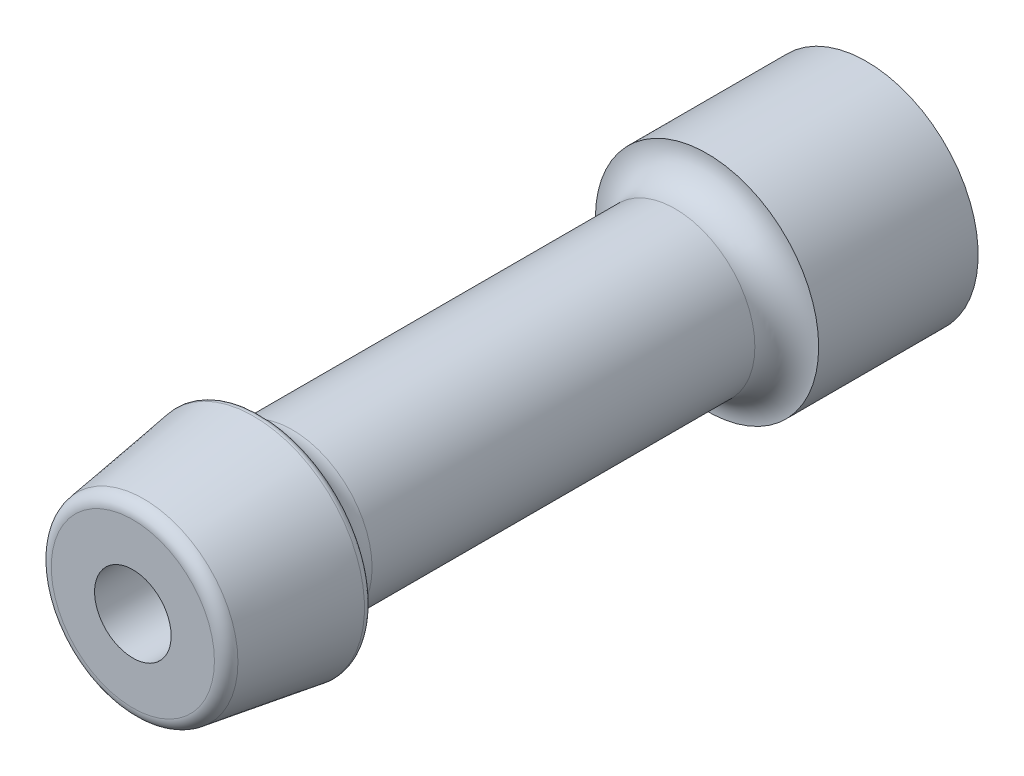
ISO-10303-21;
HEADER;
FILE_DESCRIPTION(('STEP AP214'),'2;1');
FILE_NAME('part.step','',(''),(''),'','','');
FILE_SCHEMA(('AUTOMOTIVE_DESIGN { 1 0 10303 214 1 1 1 1 }'));
ENDSEC;
DATA;
#1=APPLICATION_CONTEXT('core data for automotive mechanical design processes');
#2=APPLICATION_PROTOCOL_DEFINITION('international standard','automotive_design',2000,#1);
#3=PRODUCT_CONTEXT('',#1,'mechanical');
#4=PRODUCT('Part','Part','',(#3));
#5=PRODUCT_RELATED_PRODUCT_CATEGORY('part','',(#4));
#6=PRODUCT_DEFINITION_FORMATION('','',#4);
#7=PRODUCT_DEFINITION_CONTEXT('part definition',#1,'design');
#8=PRODUCT_DEFINITION('design','',#6,#7);
#9=PRODUCT_DEFINITION_SHAPE('','',#8);
#10=(LENGTH_UNIT() NAMED_UNIT(*) SI_UNIT(.MILLI.,.METRE.));
#11=(NAMED_UNIT(*) PLANE_ANGLE_UNIT() SI_UNIT($,.RADIAN.));
#12=(NAMED_UNIT(*) SI_UNIT($,.STERADIAN.) SOLID_ANGLE_UNIT());
#13=UNCERTAINTY_MEASURE_WITH_UNIT(LENGTH_MEASURE(1.E-05),#10,'distance_accuracy_value','');
#14=(GEOMETRIC_REPRESENTATION_CONTEXT(3) GLOBAL_UNCERTAINTY_ASSIGNED_CONTEXT((#13)) GLOBAL_UNIT_ASSIGNED_CONTEXT((#10,
#11,#12)) REPRESENTATION_CONTEXT('',''));
#15=CARTESIAN_POINT('',(0.,0.,0.));
#16=DIRECTION('',(0.,0.,1.));
#17=DIRECTION('',(1.,0.,0.));
#18=AXIS2_PLACEMENT_3D('',#15,#16,#17);
#19=CARTESIAN_POINT('',(0.,0.,29.21));
#20=DIRECTION('',(0.,0.,-1.));
#21=DIRECTION('',(-1.,0.,0.));
#22=AXIS2_PLACEMENT_3D('',#19,#20,#21);
#23=CYLINDRICAL_SURFACE('',#22,4.445);
#24=CARTESIAN_POINT('',(0.,0.,0.));
#25=DIRECTION('',(0.,0.,1.));
#26=DIRECTION('',(1.,0.,0.));
#27=AXIS2_PLACEMENT_3D('',#24,#25,#26);
#28=CIRCLE('',#27,4.445);
#29=CARTESIAN_POINT('',(-4.445,0.,0.));
#30=VERTEX_POINT('',#29);
#31=EDGE_CURVE('E71',#30,#30,#28,.T.);
#32=CARTESIAN_POINT('',(0.,0.,6.35));
#33=DIRECTION('',(0.,0.,1.));
#34=DIRECTION('',(1.,0.,0.));
#35=AXIS2_PLACEMENT_3D('',#32,#33,#34);
#36=CIRCLE('',#35,4.445);
#37=CARTESIAN_POINT('',(-4.445,0.,6.34999999999999));
#38=VERTEX_POINT('',#37);
#39=EDGE_CURVE('E72',#38,#38,#36,.T.);
#40=CARTESIAN_POINT('',(-4.445,0.,0.));
#41=CARTESIAN_POINT('',(-4.445,0.,0.066145833333333));
#42=CARTESIAN_POINT('',(-4.445,0.,0.132291666666666));
#43=CARTESIAN_POINT('',(-4.445,0.,0.264583333333332));
#44=CARTESIAN_POINT('',(-4.445,0.,0.330729166666665));
#45=CARTESIAN_POINT('',(-4.445,0.,0.463020833333332));
#46=CARTESIAN_POINT('',(-4.445,0.,0.529166666666666));
#47=CARTESIAN_POINT('',(-4.445,0.,0.661458333333333));
#48=CARTESIAN_POINT('',(-4.445,0.,0.727604166666666));
#49=CARTESIAN_POINT('',(-4.445,0.,0.859895833333332));
#50=CARTESIAN_POINT('',(-4.445,0.,0.926041666666665));
#51=CARTESIAN_POINT('',(-4.445,0.,1.05833333333333));
#52=CARTESIAN_POINT('',(-4.445,0.,1.12447916666667));
#53=CARTESIAN_POINT('',(-4.445,0.,1.25677083333333));
#54=CARTESIAN_POINT('',(-4.445,0.,1.32291666666667));
#55=CARTESIAN_POINT('',(-4.445,0.,1.45520833333333));
#56=CARTESIAN_POINT('',(-4.445,0.,1.52135416666667));
#57=CARTESIAN_POINT('',(-4.445,0.,1.65364583333333));
#58=CARTESIAN_POINT('',(-4.445,0.,1.71979166666666));
#59=CARTESIAN_POINT('',(-4.445,0.,1.85208333333333));
#60=CARTESIAN_POINT('',(-4.445,0.,1.91822916666666));
#61=CARTESIAN_POINT('',(-4.445,0.,2.05052083333333));
#62=CARTESIAN_POINT('',(-4.445,0.,2.11666666666666));
#63=CARTESIAN_POINT('',(-4.445,0.,2.24895833333333));
#64=CARTESIAN_POINT('',(-4.445,0.,2.31510416666667));
#65=CARTESIAN_POINT('',(-4.445,0.,2.44739583333333));
#66=CARTESIAN_POINT('',(-4.445,0.,2.51354166666666));
#67=CARTESIAN_POINT('',(-4.445,0.,2.64583333333333));
#68=CARTESIAN_POINT('',(-4.445,0.,2.71197916666667));
#69=CARTESIAN_POINT('',(-4.445,0.,2.84427083333333));
#70=CARTESIAN_POINT('',(-4.445,0.,2.91041666666667));
#71=CARTESIAN_POINT('',(-4.445,0.,3.04270833333333));
#72=CARTESIAN_POINT('',(-4.445,0.,3.10885416666666));
#73=CARTESIAN_POINT('',(-4.445,0.,3.24114583333333));
#74=CARTESIAN_POINT('',(-4.445,0.,3.30729166666666));
#75=CARTESIAN_POINT('',(-4.445,0.,3.43958333333333));
#76=CARTESIAN_POINT('',(-4.445,0.,3.50572916666666));
#77=CARTESIAN_POINT('',(-4.445,0.,3.63802083333333));
#78=CARTESIAN_POINT('',(-4.445,0.,3.70416666666666));
#79=CARTESIAN_POINT('',(-4.445,0.,3.83645833333333));
#80=CARTESIAN_POINT('',(-4.445,0.,3.90260416666666));
#81=CARTESIAN_POINT('',(-4.445,0.,4.03489583333333));
#82=CARTESIAN_POINT('',(-4.445,0.,4.10104166666666));
#83=CARTESIAN_POINT('',(-4.445,0.,4.23333333333333));
#84=CARTESIAN_POINT('',(-4.445,0.,4.29947916666666));
#85=CARTESIAN_POINT('',(-4.445,0.,4.43177083333333));
#86=CARTESIAN_POINT('',(-4.445,0.,4.49791666666666));
#87=CARTESIAN_POINT('',(-4.445,0.,4.63020833333333));
#88=CARTESIAN_POINT('',(-4.445,0.,4.69635416666666));
#89=CARTESIAN_POINT('',(-4.445,0.,4.82864583333333));
#90=CARTESIAN_POINT('',(-4.445,0.,4.89479166666666));
#91=CARTESIAN_POINT('',(-4.445,0.,5.02708333333333));
#92=CARTESIAN_POINT('',(-4.445,0.,5.09322916666666));
#93=CARTESIAN_POINT('',(-4.445,0.,5.22552083333333));
#94=CARTESIAN_POINT('',(-4.445,0.,5.29166666666666));
#95=CARTESIAN_POINT('',(-4.445,0.,5.42395833333333));
#96=CARTESIAN_POINT('',(-4.445,0.,5.49010416666666));
#97=CARTESIAN_POINT('',(-4.445,0.,5.62239583333333));
#98=CARTESIAN_POINT('',(-4.445,0.,5.68854166666666));
#99=CARTESIAN_POINT('',(-4.445,0.,5.82083333333333));
#100=CARTESIAN_POINT('',(-4.445,0.,5.88697916666666));
#101=CARTESIAN_POINT('',(-4.445,0.,6.01927083333333));
#102=CARTESIAN_POINT('',(-4.445,0.,6.08541666666666));
#103=CARTESIAN_POINT('',(-4.445,0.,6.21770833333333));
#104=CARTESIAN_POINT('',(-4.445,0.,6.28385416666666));
#105=CARTESIAN_POINT('',(-4.445,0.,6.34999999999999));
#106=B_SPLINE_CURVE_WITH_KNOTS('',3,(#40,#41,#42,#43,#44,#45,#46,#47,#48,#49,#50,#51,#52,#53,
#54,#55,#56,#57,#58,#59,#60,#61,#62,#63,#64,#65,#66,#67,#68,#69,#70,#71,#72,#73,#74,#75,#76,#77,
#78,#79,#80,#81,#82,#83,#84,#85,#86,#87,#88,#89,#90,#91,#92,#93,#94,#95,#96,#97,#98,#99,#100,
#101,#102,#103,#104,#105),.UNSPECIFIED.,.F.,.F.,(4,2,2,2,2,2,2,2,2,2,2,2,2,2,2,2,2,2,2,2,2,2,2,
2,2,2,2,2,2,2,2,2,4),(0.,0.198437499999999,0.396874999999998,0.5953125,0.793749999999999,
0.992187499999998,1.190625,1.3890625,1.5875,1.7859375,1.984375,2.1828125,2.38125,2.5796875,
2.778125,2.9765625,3.175,3.3734375,3.571875,3.7703125,3.96875,4.1671875,4.365625,4.5640625,
4.7625,4.96093749999999,5.15937499999999,5.3578125,5.55625,5.75468749999999,5.953125,6.1515625,
6.34999999999999),.UNSPECIFIED.);
#107=EDGE_CURVE('BSEAM39',#30,#38,#106,.T.);
#108=ORIENTED_EDGE('',*,*,#31,.T.);
#109=ORIENTED_EDGE('',*,*,#39,.F.);
#110=ORIENTED_EDGE('',*,*,#107,.T.);
#111=ORIENTED_EDGE('',*,*,#107,.F.);
#112=EDGE_LOOP('',(#108,#110,#109,#111));
#113=FACE_BOUND('',#112,.T.);
#114=ADVANCED_FACE('F39',(#113),#23,.T.);
#115=CARTESIAN_POINT('',(0.,0.,29.21));
#116=DIRECTION('',(0.,0.,1.));
#117=DIRECTION('',(1.,0.,0.));
#118=AXIS2_PLACEMENT_3D('',#115,#116,#117);
#119=PLANE('',#118);
#120=CARTESIAN_POINT('',(0.,0.,29.21));
#121=DIRECTION('',(0.,0.,1.));
#122=DIRECTION('',(1.,0.,0.));
#123=AXIS2_PLACEMENT_3D('',#120,#121,#122);
#124=CIRCLE('',#123,3.24806810887687);
#125=CARTESIAN_POINT('',(3.24806810887687,0.,29.21));
#126=VERTEX_POINT('',#125);
#127=EDGE_CURVE('E47',#126,#126,#124,.T.);
#128=ORIENTED_EDGE('',*,*,#127,.T.);
#129=EDGE_LOOP('',(#128));
#130=FACE_BOUND('',#129,.T.);
#131=CARTESIAN_POINT('',(0.,0.,29.21));
#132=DIRECTION('',(0.,0.,1.));
#133=DIRECTION('',(1.,0.,0.));
#134=AXIS2_PLACEMENT_3D('',#131,#132,#133);
#135=CIRCLE('',#134,1.524);
#136=CARTESIAN_POINT('',(1.524,0.,29.21));
#137=VERTEX_POINT('',#136);
#138=EDGE_CURVE('E76',#137,#137,#135,.T.);
#139=ORIENTED_EDGE('',*,*,#138,.F.);
#140=EDGE_LOOP('',(#139));
#141=FACE_BOUND('',#140,.T.);
#142=ADVANCED_FACE('F90',(#130,#141),#119,.T.);
#143=CARTESIAN_POINT('',(0.,0.,0.));
#144=DIRECTION('',(0.,0.,1.));
#145=DIRECTION('',(1.,0.,0.));
#146=AXIS2_PLACEMENT_3D('',#143,#144,#145);
#147=PLANE('',#146);
#148=CARTESIAN_POINT('',(0.,0.,0.));
#149=DIRECTION('',(0.,0.,1.));
#150=DIRECTION('',(1.,0.,0.));
#151=AXIS2_PLACEMENT_3D('',#148,#149,#150);
#152=CIRCLE('',#151,1.524);
#153=CARTESIAN_POINT('',(1.524,0.,0.));
#154=VERTEX_POINT('',#153);
#155=EDGE_CURVE('E80',#154,#154,#152,.T.);
#156=ORIENTED_EDGE('',*,*,#155,.T.);
#157=EDGE_LOOP('',(#156));
#158=FACE_BOUND('',#157,.T.);
#159=ORIENTED_EDGE('',*,*,#31,.F.);
#160=EDGE_LOOP('',(#159));
#161=FACE_BOUND('',#160,.T.);
#162=ADVANCED_FACE('F92',(#158,#161),#147,.F.);
#163=CARTESIAN_POINT('',(0.,0.,30.21));
#164=DIRECTION('',(0.,0.,-1.));
#165=DIRECTION('',(-1.,0.,0.));
#166=AXIS2_PLACEMENT_3D('',#163,#164,#165);
#167=CYLINDRICAL_SURFACE('',#166,1.524);
#168=ORIENTED_EDGE('',*,*,#155,.F.);
#169=EDGE_LOOP('',(#168));
#170=FACE_BOUND('',#169,.T.);
#171=ORIENTED_EDGE('',*,*,#138,.T.);
#172=EDGE_LOOP('',(#171));
#173=FACE_BOUND('',#172,.T.);
#174=ADVANCED_FACE('F88',(#170,#173),#167,.F.);
#175=CARTESIAN_POINT('',(0.,0.,6.35));
#176=DIRECTION('',(0.,0.,1.));
#177=DIRECTION('',(1.,0.,0.));
#178=AXIS2_PLACEMENT_3D('',#175,#176,#177);
#179=CYLINDRICAL_SURFACE('',#178,3.175);
#180=CARTESIAN_POINT('',(0.,0.,22.86));
#181=DIRECTION('',(0.,0.,1.));
#182=DIRECTION('',(1.,0.,0.));
#183=AXIS2_PLACEMENT_3D('',#180,#181,#182);
#184=CIRCLE('',#183,3.175);
#185=CARTESIAN_POINT('',(3.175,0.,22.86));
#186=VERTEX_POINT('',#185);
#187=EDGE_CURVE('E63',#186,#186,#184,.F.);
#188=ORIENTED_EDGE('',*,*,#187,.T.);
#189=EDGE_LOOP('',(#188));
#190=FACE_BOUND('',#189,.T.);
#191=CARTESIAN_POINT('',(0.,0.,7.62));
#192=DIRECTION('',(0.,0.,1.));
#193=DIRECTION('',(1.,0.,0.));
#194=AXIS2_PLACEMENT_3D('',#191,#192,#193);
#195=CIRCLE('',#194,3.175);
#196=CARTESIAN_POINT('',(3.175,0.,7.62));
#197=VERTEX_POINT('',#196);
#198=EDGE_CURVE('E67',#197,#197,#195,.T.);
#199=ORIENTED_EDGE('',*,*,#198,.T.);
#200=EDGE_LOOP('',(#199));
#201=FACE_BOUND('',#200,.T.);
#202=ADVANCED_FACE('F109',(#190,#201),#179,.T.);
#203=CARTESIAN_POINT('',(0.,0.,7.62));
#204=DIRECTION('',(0.,0.,1.));
#205=DIRECTION('',(1.,0.,0.));
#206=AXIS2_PLACEMENT_3D('',#203,#204,#205);
#207=TOROIDAL_SURFACE('',#206,4.445,1.27);
#208=ORIENTED_EDGE('',*,*,#39,.T.);
#209=EDGE_LOOP('',(#208));
#210=FACE_BOUND('',#209,.T.);
#211=ORIENTED_EDGE('',*,*,#198,.F.);
#212=EDGE_LOOP('',(#211));
#213=FACE_BOUND('',#212,.T.);
#214=ADVANCED_FACE('F105',(#210,#213),#207,.F.);
#215=CARTESIAN_POINT('',(0.,0.,22.86));
#216=DIRECTION('',(0.,0.,1.));
#217=DIRECTION('',(1.,0.,0.));
#218=AXIS2_PLACEMENT_3D('',#215,#216,#217);
#219=TOROIDAL_SURFACE('',#218,4.445,1.27);
#220=CARTESIAN_POINT('',(0.,0.,24.1066973734676));
#221=DIRECTION('',(0.,0.,-1.));
#222=DIRECTION('',(-1.,0.,0.));
#223=AXIS2_PLACEMENT_3D('',#220,#221,#222);
#224=CIRCLE('',#223,4.20283134185255);
#225=CARTESIAN_POINT('',(-4.20283134185255,0.,24.1066973734676));
#226=VERTEX_POINT('',#225);
#227=EDGE_CURVE('E52',#226,#226,#224,.T.);
#228=ORIENTED_EDGE('',*,*,#227,.T.);
#229=EDGE_LOOP('',(#228));
#230=FACE_BOUND('',#229,.T.);
#231=ORIENTED_EDGE('',*,*,#187,.F.);
#232=EDGE_LOOP('',(#231));
#233=FACE_BOUND('',#232,.T.);
#234=ADVANCED_FACE('F108',(#230,#233),#219,.F.);
#235=CARTESIAN_POINT('',(0.,0.,29.21));
#236=DIRECTION('',(0.,0.,-1.));
#237=DIRECTION('',(-1.,0.,0.));
#238=AXIS2_PLACEMENT_3D('',#235,#236,#237);
#239=CONICAL_SURFACE('',#238,3.68578891314646,0.148352986419515);
#240=CARTESIAN_POINT('',(0.,0.,28.7770871808538));
#241=DIRECTION('',(0.,0.,1.));
#242=DIRECTION('',(1.,0.,0.));
#243=AXIS2_PLACEMENT_3D('',#240,#241,#242);
#244=CIRCLE('',#243,3.75048816746473);
#245=CARTESIAN_POINT('',(3.75048816746473,0.,28.7770871808538));
#246=VERTEX_POINT('',#245);
#247=EDGE_CURVE('E10',#246,#246,#244,.F.);
#248=ORIENTED_EDGE('',*,*,#247,.T.);
#249=EDGE_LOOP('',(#248));
#250=FACE_BOUND('',#249,.T.);
#251=CARTESIAN_POINT('',(0.,0.,24.3935804385881));
#252=DIRECTION('',(0.,0.,-1.));
#253=DIRECTION('',(-1.,0.,0.));
#254=AXIS2_PLACEMENT_3D('',#251,#252,#253);
#255=CIRCLE('',#254,4.40560763951698);
#256=CARTESIAN_POINT('',(-4.40560763951698,0.,24.3935804385881));
#257=VERTEX_POINT('',#256);
#258=EDGE_CURVE('E57',#257,#257,#255,.F.);
#259=ORIENTED_EDGE('',*,*,#258,.T.);
#260=EDGE_LOOP('',(#259));
#261=FACE_BOUND('',#260,.T.);
#262=ADVANCED_FACE('F113',(#250,#261),#239,.T.);
#263=CARTESIAN_POINT('',(0.,0.,24.3560368481611));
#264=DIRECTION('',(0.,0.,-1.));
#265=DIRECTION('',(-1.,0.,0.));
#266=AXIS2_PLACEMENT_3D('',#263,#264,#265);
#267=TOROIDAL_SURFACE('',#266,4.15439761022306,0.254);
#268=ORIENTED_EDGE('',*,*,#227,.F.);
#269=EDGE_LOOP('',(#268));
#270=FACE_BOUND('',#269,.T.);
#271=ORIENTED_EDGE('',*,*,#258,.F.);
#272=EDGE_LOOP('',(#271));
#273=FACE_BOUND('',#272,.T.);
#274=ADVANCED_FACE('F119',(#270,#273),#267,.T.);
#275=CARTESIAN_POINT('',(0.,0.,28.702));
#276=DIRECTION('',(0.,0.,1.));
#277=DIRECTION('',(1.,0.,0.));
#278=AXIS2_PLACEMENT_3D('',#275,#276,#277);
#279=TOROIDAL_SURFACE('',#278,3.24806810887687,0.508);
#280=ORIENTED_EDGE('',*,*,#247,.F.);
#281=EDGE_LOOP('',(#280));
#282=FACE_BOUND('',#281,.T.);
#283=ORIENTED_EDGE('',*,*,#127,.F.);
#284=EDGE_LOOP('',(#283));
#285=FACE_BOUND('',#284,.T.);
#286=ADVANCED_FACE('F41',(#282,#285),#279,.T.);
#287=CLOSED_SHELL('',(#114,#142,#162,#174,#202,#214,#234,#262,#274,#286));
#288=MANIFOLD_SOLID_BREP('B2',#287);
#289=ADVANCED_BREP_SHAPE_REPRESENTATION('',(#18,#288),#14);
#290=SHAPE_DEFINITION_REPRESENTATION(#9,#289);
ENDSEC;
END-ISO-10303-21;
